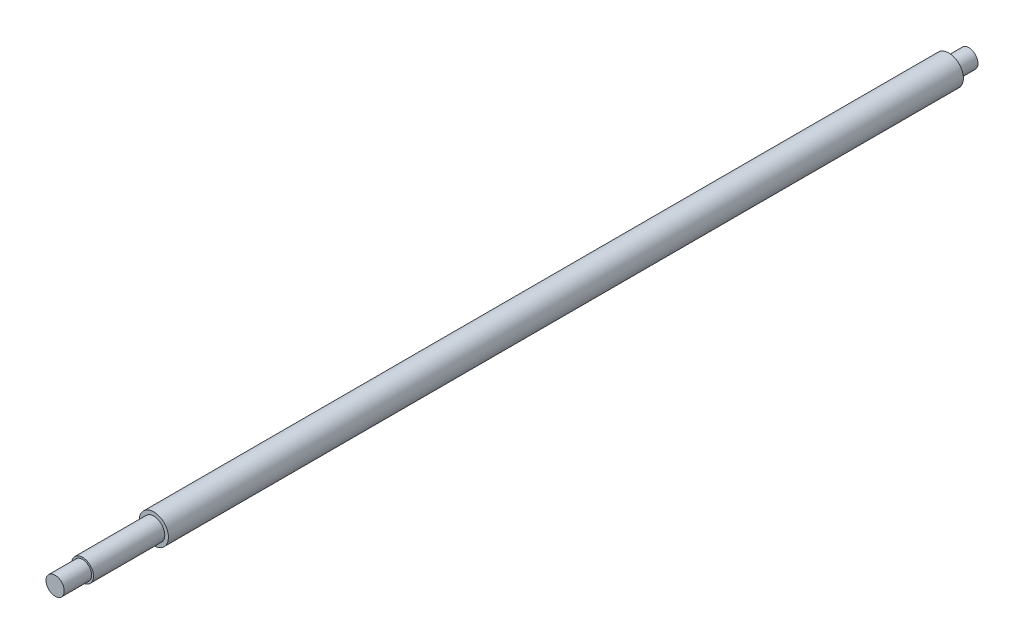
ISO-10303-21;
HEADER;
FILE_DESCRIPTION(('STEP AP214'),'2;1');
FILE_NAME('part.step','',(''),(''),'','','');
FILE_SCHEMA(('AUTOMOTIVE_DESIGN { 1 0 10303 214 1 1 1 1 }'));
ENDSEC;
DATA;
#1=APPLICATION_CONTEXT('core data for automotive mechanical design processes');
#2=APPLICATION_PROTOCOL_DEFINITION('international standard','automotive_design',2000,#1);
#3=PRODUCT_CONTEXT('',#1,'mechanical');
#4=PRODUCT('Part','Part','',(#3));
#5=PRODUCT_RELATED_PRODUCT_CATEGORY('part','',(#4));
#6=PRODUCT_DEFINITION_FORMATION('','',#4);
#7=PRODUCT_DEFINITION_CONTEXT('part definition',#1,'design');
#8=PRODUCT_DEFINITION('design','',#6,#7);
#9=PRODUCT_DEFINITION_SHAPE('','',#8);
#10=(LENGTH_UNIT() NAMED_UNIT(*) SI_UNIT(.MILLI.,.METRE.));
#11=(NAMED_UNIT(*) PLANE_ANGLE_UNIT() SI_UNIT($,.RADIAN.));
#12=(NAMED_UNIT(*) SI_UNIT($,.STERADIAN.) SOLID_ANGLE_UNIT());
#13=UNCERTAINTY_MEASURE_WITH_UNIT(LENGTH_MEASURE(1.E-05),#10,'distance_accuracy_value','');
#14=(GEOMETRIC_REPRESENTATION_CONTEXT(3) GLOBAL_UNCERTAINTY_ASSIGNED_CONTEXT((#13)) GLOBAL_UNIT_ASSIGNED_CONTEXT((#10,
#11,#12)) REPRESENTATION_CONTEXT('',''));
#15=CARTESIAN_POINT('',(0.,0.,0.));
#16=DIRECTION('',(0.,0.,1.));
#17=DIRECTION('',(1.,0.,0.));
#18=AXIS2_PLACEMENT_3D('',#15,#16,#17);
#19=CARTESIAN_POINT('',(0.,0.,0.));
#20=DIRECTION('',(0.,0.,1.));
#21=DIRECTION('',(1.,0.,0.));
#22=AXIS2_PLACEMENT_3D('',#19,#20,#21);
#23=PLANE('',#22);
#24=CARTESIAN_POINT('',(0.,0.,0.));
#25=DIRECTION('',(0.,0.,1.));
#26=DIRECTION('',(1.,0.,0.));
#27=AXIS2_PLACEMENT_3D('',#24,#25,#26);
#28=CIRCLE('',#27,5.);
#29=CARTESIAN_POINT('',(5.,0.,0.));
#30=VERTEX_POINT('',#29);
#31=EDGE_CURVE('E10',#30,#30,#28,.T.);
#32=ORIENTED_EDGE('',*,*,#31,.T.);
#33=EDGE_LOOP('',(#32));
#34=FACE_BOUND('',#33,.T.);
#35=ADVANCED_FACE('F31',(#34),#23,.T.);
#36=CARTESIAN_POINT('',(0.,0.,0.));
#37=DIRECTION('',(0.,0.,1.));
#38=DIRECTION('',(1.,0.,0.));
#39=AXIS2_PLACEMENT_3D('',#36,#37,#38);
#40=CYLINDRICAL_SURFACE('',#39,5.);
#41=CARTESIAN_POINT('',(0.,0.,-15.));
#42=DIRECTION('',(0.,0.,1.));
#43=DIRECTION('',(1.,0.,0.));
#44=AXIS2_PLACEMENT_3D('',#41,#42,#43);
#45=CIRCLE('',#44,5.);
#46=CARTESIAN_POINT('',(5.,0.,-15.));
#47=VERTEX_POINT('',#46);
#48=EDGE_CURVE('E37',#47,#47,#45,.T.);
#49=ORIENTED_EDGE('',*,*,#48,.T.);
#50=EDGE_LOOP('',(#49));
#51=FACE_BOUND('',#50,.T.);
#52=ORIENTED_EDGE('',*,*,#31,.F.);
#53=EDGE_LOOP('',(#52));
#54=FACE_BOUND('',#53,.T.);
#55=ADVANCED_FACE('F75',(#51,#54),#40,.T.);
#56=CARTESIAN_POINT('',(5.,0.,-15.));
#57=DIRECTION('',(0.,0.,1.));
#58=DIRECTION('',(1.,0.,0.));
#59=AXIS2_PLACEMENT_3D('',#56,#57,#58);
#60=PLANE('',#59);
#61=CARTESIAN_POINT('',(0.,0.,-15.));
#62=DIRECTION('',(0.,0.,1.));
#63=DIRECTION('',(1.,0.,0.));
#64=AXIS2_PLACEMENT_3D('',#61,#62,#63);
#65=CIRCLE('',#64,6.);
#66=CARTESIAN_POINT('',(6.,0.,-15.));
#67=VERTEX_POINT('',#66);
#68=EDGE_CURVE('E41',#67,#67,#65,.T.);
#69=ORIENTED_EDGE('',*,*,#68,.T.);
#70=EDGE_LOOP('',(#69));
#71=FACE_BOUND('',#70,.T.);
#72=ORIENTED_EDGE('',*,*,#48,.F.);
#73=EDGE_LOOP('',(#72));
#74=FACE_BOUND('',#73,.T.);
#75=ADVANCED_FACE('F79',(#71,#74),#60,.T.);
#76=CARTESIAN_POINT('',(0.,0.,0.));
#77=DIRECTION('',(0.,0.,1.));
#78=DIRECTION('',(1.,0.,0.));
#79=AXIS2_PLACEMENT_3D('',#76,#77,#78);
#80=CYLINDRICAL_SURFACE('',#79,6.);
#81=CARTESIAN_POINT('',(0.,0.,-54.));
#82=DIRECTION('',(0.,0.,1.));
#83=DIRECTION('',(1.,0.,0.));
#84=AXIS2_PLACEMENT_3D('',#81,#82,#83);
#85=CIRCLE('',#84,6.);
#86=CARTESIAN_POINT('',(6.,0.,-54.));
#87=VERTEX_POINT('',#86);
#88=EDGE_CURVE('E45',#87,#87,#85,.T.);
#89=ORIENTED_EDGE('',*,*,#88,.T.);
#90=EDGE_LOOP('',(#89));
#91=FACE_BOUND('',#90,.T.);
#92=ORIENTED_EDGE('',*,*,#68,.F.);
#93=EDGE_LOOP('',(#92));
#94=FACE_BOUND('',#93,.T.);
#95=ADVANCED_FACE('F83',(#91,#94),#80,.T.);
#96=CARTESIAN_POINT('',(6.,0.,-54.));
#97=DIRECTION('',(0.,0.,1.));
#98=DIRECTION('',(1.,0.,0.));
#99=AXIS2_PLACEMENT_3D('',#96,#97,#98);
#100=PLANE('',#99);
#101=CARTESIAN_POINT('',(0.,0.,-54.));
#102=DIRECTION('',(0.,0.,1.));
#103=DIRECTION('',(1.,0.,0.));
#104=AXIS2_PLACEMENT_3D('',#101,#102,#103);
#105=CIRCLE('',#104,8.);
#106=CARTESIAN_POINT('',(8.,0.,-54.));
#107=VERTEX_POINT('',#106);
#108=EDGE_CURVE('E50',#107,#107,#105,.T.);
#109=ORIENTED_EDGE('',*,*,#108,.T.);
#110=EDGE_LOOP('',(#109));
#111=FACE_BOUND('',#110,.T.);
#112=ORIENTED_EDGE('',*,*,#88,.F.);
#113=EDGE_LOOP('',(#112));
#114=FACE_BOUND('',#113,.T.);
#115=ADVANCED_FACE('F90',(#111,#114),#100,.T.);
#116=CARTESIAN_POINT('',(0.,0.,0.));
#117=DIRECTION('',(0.,0.,1.));
#118=DIRECTION('',(1.,0.,0.));
#119=AXIS2_PLACEMENT_3D('',#116,#117,#118);
#120=CYLINDRICAL_SURFACE('',#119,8.);
#121=CARTESIAN_POINT('',(0.,0.,-489.));
#122=DIRECTION('',(0.,0.,1.));
#123=DIRECTION('',(1.,0.,0.));
#124=AXIS2_PLACEMENT_3D('',#121,#122,#123);
#125=CIRCLE('',#124,8.);
#126=CARTESIAN_POINT('',(8.,0.,-489.));
#127=VERTEX_POINT('',#126);
#128=EDGE_CURVE('E53',#127,#127,#125,.T.);
#129=ORIENTED_EDGE('',*,*,#128,.T.);
#130=EDGE_LOOP('',(#129));
#131=FACE_BOUND('',#130,.T.);
#132=ORIENTED_EDGE('',*,*,#108,.F.);
#133=EDGE_LOOP('',(#132));
#134=FACE_BOUND('',#133,.T.);
#135=ADVANCED_FACE('F94',(#131,#134),#120,.T.);
#136=CARTESIAN_POINT('',(8.,0.,-489.));
#137=DIRECTION('',(0.,0.,-1.));
#138=DIRECTION('',(-1.,0.,0.));
#139=AXIS2_PLACEMENT_3D('',#136,#137,#138);
#140=PLANE('',#139);
#141=CARTESIAN_POINT('',(0.,0.,-489.));
#142=DIRECTION('',(0.,0.,1.));
#143=DIRECTION('',(1.,0.,0.));
#144=AXIS2_PLACEMENT_3D('',#141,#142,#143);
#145=CIRCLE('',#144,5.);
#146=CARTESIAN_POINT('',(5.,0.,-489.));
#147=VERTEX_POINT('',#146);
#148=EDGE_CURVE('E56',#147,#147,#145,.T.);
#149=ORIENTED_EDGE('',*,*,#148,.T.);
#150=EDGE_LOOP('',(#149));
#151=FACE_BOUND('',#150,.T.);
#152=ORIENTED_EDGE('',*,*,#128,.F.);
#153=EDGE_LOOP('',(#152));
#154=FACE_BOUND('',#153,.T.);
#155=ADVANCED_FACE('F72',(#151,#154),#140,.T.);
#156=CARTESIAN_POINT('',(0.,0.,0.));
#157=DIRECTION('',(0.,0.,1.));
#158=DIRECTION('',(1.,0.,0.));
#159=AXIS2_PLACEMENT_3D('',#156,#157,#158);
#160=CYLINDRICAL_SURFACE('',#159,5.);
#161=CARTESIAN_POINT('',(0.,0.,-500.));
#162=DIRECTION('',(0.,0.,1.));
#163=DIRECTION('',(1.,0.,0.));
#164=AXIS2_PLACEMENT_3D('',#161,#162,#163);
#165=CIRCLE('',#164,5.);
#166=CARTESIAN_POINT('',(5.,0.,-500.));
#167=VERTEX_POINT('',#166);
#168=EDGE_CURVE('E59',#167,#167,#165,.T.);
#169=ORIENTED_EDGE('',*,*,#168,.T.);
#170=EDGE_LOOP('',(#169));
#171=FACE_BOUND('',#170,.T.);
#172=ORIENTED_EDGE('',*,*,#148,.F.);
#173=EDGE_LOOP('',(#172));
#174=FACE_BOUND('',#173,.T.);
#175=ADVANCED_FACE('F63',(#171,#174),#160,.T.);
#176=CARTESIAN_POINT('',(5.,0.,-500.));
#177=DIRECTION('',(0.,0.,-1.));
#178=DIRECTION('',(-1.,0.,0.));
#179=AXIS2_PLACEMENT_3D('',#176,#177,#178);
#180=PLANE('',#179);
#181=ORIENTED_EDGE('',*,*,#168,.F.);
#182=EDGE_LOOP('',(#181));
#183=FACE_BOUND('',#182,.T.);
#184=ADVANCED_FACE('F66',(#183),#180,.T.);
#185=CLOSED_SHELL('',(#35,#55,#75,#95,#115,#135,#155,#175,#184));
#186=MANIFOLD_SOLID_BREP('B2',#185);
#187=ADVANCED_BREP_SHAPE_REPRESENTATION('',(#18,#186),#14);
#188=SHAPE_DEFINITION_REPRESENTATION(#9,#187);
ENDSEC;
END-ISO-10303-21;
